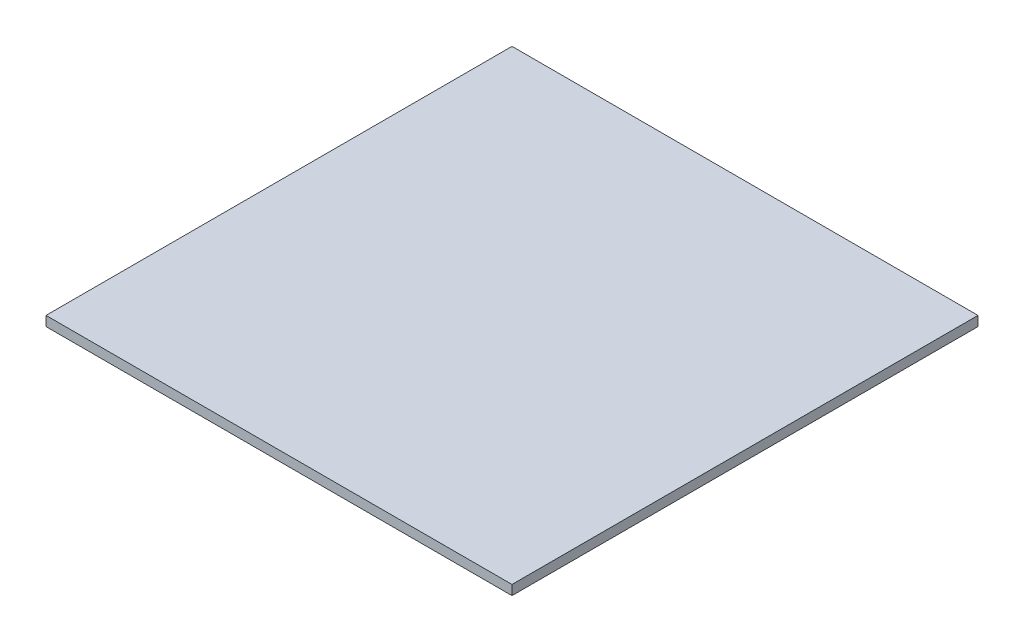
ISO-10303-21;
HEADER;
FILE_DESCRIPTION(('STEP AP214'),'2;1');
FILE_NAME('part.step','',(''),(''),'','','');
FILE_SCHEMA(('AUTOMOTIVE_DESIGN { 1 0 10303 214 1 1 1 1 }'));
ENDSEC;
DATA;
#1=APPLICATION_CONTEXT('core data for automotive mechanical design processes');
#2=APPLICATION_PROTOCOL_DEFINITION('international standard','automotive_design',2000,#1);
#3=PRODUCT_CONTEXT('',#1,'mechanical');
#4=PRODUCT('Part','Part','',(#3));
#5=PRODUCT_RELATED_PRODUCT_CATEGORY('part','',(#4));
#6=PRODUCT_DEFINITION_FORMATION('','',#4);
#7=PRODUCT_DEFINITION_CONTEXT('part definition',#1,'design');
#8=PRODUCT_DEFINITION('design','',#6,#7);
#9=PRODUCT_DEFINITION_SHAPE('','',#8);
#10=(LENGTH_UNIT() NAMED_UNIT(*) SI_UNIT(.MILLI.,.METRE.));
#11=(NAMED_UNIT(*) PLANE_ANGLE_UNIT() SI_UNIT($,.RADIAN.));
#12=(NAMED_UNIT(*) SI_UNIT($,.STERADIAN.) SOLID_ANGLE_UNIT());
#13=UNCERTAINTY_MEASURE_WITH_UNIT(LENGTH_MEASURE(1.E-05),#10,'distance_accuracy_value','');
#14=(GEOMETRIC_REPRESENTATION_CONTEXT(3) GLOBAL_UNCERTAINTY_ASSIGNED_CONTEXT((#13)) GLOBAL_UNIT_ASSIGNED_CONTEXT((#10,
#11,#12)) REPRESENTATION_CONTEXT('',''));
#15=CARTESIAN_POINT('',(0.,0.,0.));
#16=DIRECTION('',(0.,0.,1.));
#17=DIRECTION('',(1.,0.,0.));
#18=AXIS2_PLACEMENT_3D('',#15,#16,#17);
#19=CARTESIAN_POINT('',(-76.2,1.5875,76.2));
#20=DIRECTION('',(1.,0.,0.));
#21=DIRECTION('',(0.,0.,-1.));
#22=AXIS2_PLACEMENT_3D('',#19,#20,#21);
#23=PLANE('',#22);
#24=DIRECTION('',(0.,0.,-1.));
#25=VECTOR('',#24,1.);
#26=CARTESIAN_POINT('',(-76.2,1.5875,76.2));
#27=LINE('',#26,#25);
#28=CARTESIAN_POINT('',(-76.2,1.5875,76.2));
#29=VERTEX_POINT('',#28);
#30=CARTESIAN_POINT('',(-76.2,1.5875,-76.2));
#31=VERTEX_POINT('',#30);
#32=EDGE_CURVE('E89',#29,#31,#27,.T.);
#33=ORIENTED_EDGE('',*,*,#32,.T.);
#34=DIRECTION('',(0.,-1.,0.));
#35=VECTOR('',#34,1.);
#36=CARTESIAN_POINT('',(-76.2,1.5875,-76.2));
#37=LINE('',#36,#35);
#38=CARTESIAN_POINT('',(-76.2,-1.5875,-76.2));
#39=VERTEX_POINT('',#38);
#40=EDGE_CURVE('E84',#31,#39,#37,.T.);
#41=ORIENTED_EDGE('',*,*,#40,.T.);
#42=DIRECTION('',(0.,0.,-1.));
#43=VECTOR('',#42,1.);
#44=CARTESIAN_POINT('',(-76.2,-1.5875,76.2));
#45=LINE('',#44,#43);
#46=CARTESIAN_POINT('',(-76.2,-1.5875,76.2));
#47=VERTEX_POINT('',#46);
#48=EDGE_CURVE('E11',#47,#39,#45,.T.);
#49=ORIENTED_EDGE('',*,*,#48,.F.);
#50=DIRECTION('',(0.,-1.,0.));
#51=VECTOR('',#50,1.);
#52=CARTESIAN_POINT('',(-76.2,1.5875,76.2));
#53=LINE('',#52,#51);
#54=EDGE_CURVE('E95',#29,#47,#53,.T.);
#55=ORIENTED_EDGE('',*,*,#54,.F.);
#56=EDGE_LOOP('',(#33,#41,#49,#55));
#57=FACE_BOUND('',#56,.T.);
#58=ADVANCED_FACE('F32',(#57),#23,.F.);
#59=CARTESIAN_POINT('',(76.2,-1.5875,76.2));
#60=DIRECTION('',(0.,1.,0.));
#61=DIRECTION('',(0.,0.,1.));
#62=AXIS2_PLACEMENT_3D('',#59,#60,#61);
#63=PLANE('',#62);
#64=ORIENTED_EDGE('',*,*,#48,.T.);
#65=DIRECTION('',(1.,0.,0.));
#66=VECTOR('',#65,1.);
#67=CARTESIAN_POINT('',(76.2,-1.5875,-76.2));
#68=LINE('',#67,#66);
#69=CARTESIAN_POINT('',(76.2,-1.5875,-76.2));
#70=VERTEX_POINT('',#69);
#71=EDGE_CURVE('E74',#39,#70,#68,.T.);
#72=ORIENTED_EDGE('',*,*,#71,.T.);
#73=DIRECTION('',(0.,0.,-1.));
#74=VECTOR('',#73,1.);
#75=CARTESIAN_POINT('',(76.2,-1.5875,76.2));
#76=LINE('',#75,#74);
#77=CARTESIAN_POINT('',(76.2,-1.5875,76.2));
#78=VERTEX_POINT('',#77);
#79=EDGE_CURVE('E39',#78,#70,#76,.T.);
#80=ORIENTED_EDGE('',*,*,#79,.F.);
#81=DIRECTION('',(1.,0.,0.));
#82=VECTOR('',#81,1.);
#83=CARTESIAN_POINT('',(76.2,-1.5875,76.2));
#84=LINE('',#83,#82);
#85=EDGE_CURVE('E75',#47,#78,#84,.T.);
#86=ORIENTED_EDGE('',*,*,#85,.F.);
#87=EDGE_LOOP('',(#64,#72,#80,#86));
#88=FACE_BOUND('',#87,.T.);
#89=ADVANCED_FACE('F72',(#88),#63,.F.);
#90=CARTESIAN_POINT('',(76.2,1.5875,76.2));
#91=DIRECTION('',(-1.,0.,0.));
#92=DIRECTION('',(0.,0.,1.));
#93=AXIS2_PLACEMENT_3D('',#90,#91,#92);
#94=PLANE('',#93);
#95=ORIENTED_EDGE('',*,*,#79,.T.);
#96=DIRECTION('',(0.,1.,0.));
#97=VECTOR('',#96,1.);
#98=CARTESIAN_POINT('',(76.2,1.5875,-76.2));
#99=LINE('',#98,#97);
#100=CARTESIAN_POINT('',(76.2,1.5875,-76.2));
#101=VERTEX_POINT('',#100);
#102=EDGE_CURVE('E87',#70,#101,#99,.T.);
#103=ORIENTED_EDGE('',*,*,#102,.T.);
#104=DIRECTION('',(0.,0.,-1.));
#105=VECTOR('',#104,1.);
#106=CARTESIAN_POINT('',(76.2,1.5875,76.2));
#107=LINE('',#106,#105);
#108=CARTESIAN_POINT('',(76.2,1.5875,76.2));
#109=VERTEX_POINT('',#108);
#110=EDGE_CURVE('E101',#109,#101,#107,.T.);
#111=ORIENTED_EDGE('',*,*,#110,.F.);
#112=DIRECTION('',(0.,1.,0.));
#113=VECTOR('',#112,1.);
#114=CARTESIAN_POINT('',(76.2,1.5875,76.2));
#115=LINE('',#114,#113);
#116=EDGE_CURVE('E51',#78,#109,#115,.T.);
#117=ORIENTED_EDGE('',*,*,#116,.F.);
#118=EDGE_LOOP('',(#95,#103,#111,#117));
#119=FACE_BOUND('',#118,.T.);
#120=ADVANCED_FACE('F103',(#119),#94,.F.);
#121=CARTESIAN_POINT('',(76.2,1.5875,76.2));
#122=DIRECTION('',(0.,-1.,0.));
#123=DIRECTION('',(0.,0.,-1.));
#124=AXIS2_PLACEMENT_3D('',#121,#122,#123);
#125=PLANE('',#124);
#126=ORIENTED_EDGE('',*,*,#110,.T.);
#127=DIRECTION('',(-1.,0.,0.));
#128=VECTOR('',#127,1.);
#129=CARTESIAN_POINT('',(76.2,1.5875,-76.2));
#130=LINE('',#129,#128);
#131=EDGE_CURVE('E93',#101,#31,#130,.T.);
#132=ORIENTED_EDGE('',*,*,#131,.T.);
#133=ORIENTED_EDGE('',*,*,#32,.F.);
#134=DIRECTION('',(-1.,0.,0.));
#135=VECTOR('',#134,1.);
#136=CARTESIAN_POINT('',(76.2,1.5875,76.2));
#137=LINE('',#136,#135);
#138=EDGE_CURVE('E46',#109,#29,#137,.T.);
#139=ORIENTED_EDGE('',*,*,#138,.F.);
#140=EDGE_LOOP('',(#126,#132,#133,#139));
#141=FACE_BOUND('',#140,.T.);
#142=ADVANCED_FACE('F105',(#141),#125,.F.);
#143=CARTESIAN_POINT('',(0.,0.,76.2));
#144=DIRECTION('',(0.,0.,-1.));
#145=DIRECTION('',(-1.,0.,0.));
#146=AXIS2_PLACEMENT_3D('',#143,#144,#145);
#147=PLANE('',#146);
#148=ORIENTED_EDGE('',*,*,#54,.T.);
#149=ORIENTED_EDGE('',*,*,#85,.T.);
#150=ORIENTED_EDGE('',*,*,#116,.T.);
#151=ORIENTED_EDGE('',*,*,#138,.T.);
#152=EDGE_LOOP('',(#148,#149,#150,#151));
#153=FACE_BOUND('',#152,.T.);
#154=ADVANCED_FACE('F106',(#153),#147,.F.);
#155=CARTESIAN_POINT('',(0.,0.,-76.2));
#156=DIRECTION('',(0.,0.,-1.));
#157=DIRECTION('',(-1.,0.,0.));
#158=AXIS2_PLACEMENT_3D('',#155,#156,#157);
#159=PLANE('',#158);
#160=ORIENTED_EDGE('',*,*,#40,.F.);
#161=ORIENTED_EDGE('',*,*,#131,.F.);
#162=ORIENTED_EDGE('',*,*,#102,.F.);
#163=ORIENTED_EDGE('',*,*,#71,.F.);
#164=EDGE_LOOP('',(#160,#161,#162,#163));
#165=FACE_BOUND('',#164,.T.);
#166=ADVANCED_FACE('F82',(#165),#159,.T.);
#167=CLOSED_SHELL('',(#58,#89,#120,#142,#154,#166));
#168=MANIFOLD_SOLID_BREP('B2',#167);
#169=ADVANCED_BREP_SHAPE_REPRESENTATION('',(#18,#168),#14);
#170=SHAPE_DEFINITION_REPRESENTATION(#9,#169);
ENDSEC;
END-ISO-10303-21;
